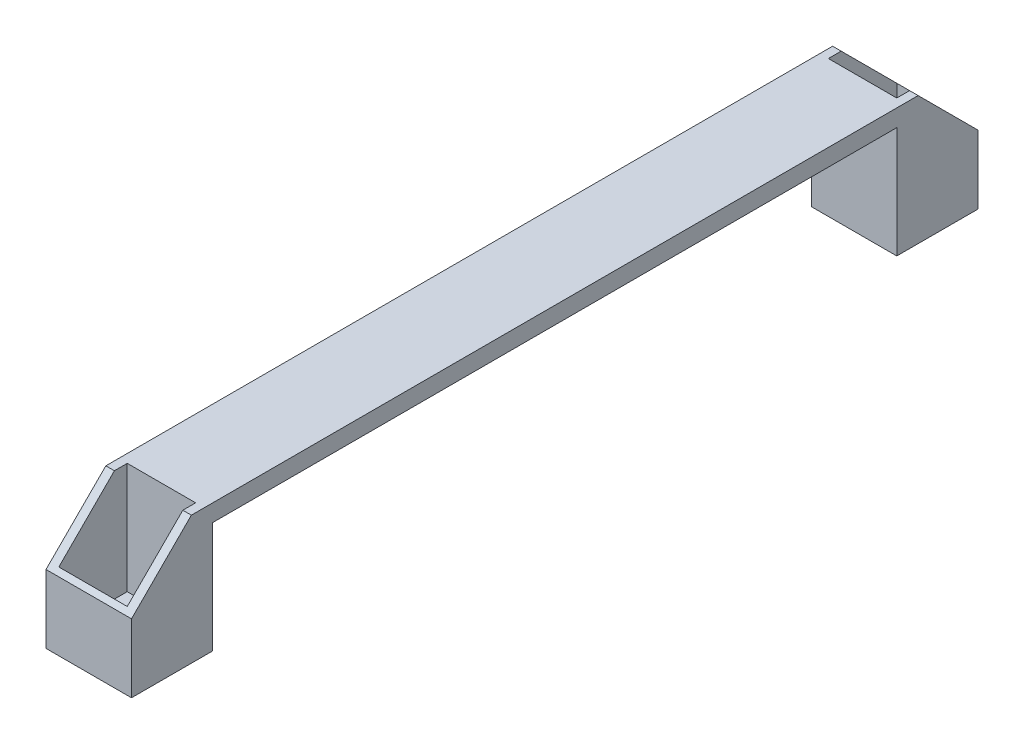
ISO-10303-21;
HEADER;
FILE_DESCRIPTION(('STEP AP214'),'2;1');
FILE_NAME('part.step','',(''),(''),'','','');
FILE_SCHEMA(('AUTOMOTIVE_DESIGN { 1 0 10303 214 1 1 1 1 }'));
ENDSEC;
DATA;
#1=APPLICATION_CONTEXT('core data for automotive mechanical design processes');
#2=APPLICATION_PROTOCOL_DEFINITION('international standard','automotive_design',2000,#1);
#3=PRODUCT_CONTEXT('',#1,'mechanical');
#4=PRODUCT('Part','Part','',(#3));
#5=PRODUCT_RELATED_PRODUCT_CATEGORY('part','',(#4));
#6=PRODUCT_DEFINITION_FORMATION('','',#4);
#7=PRODUCT_DEFINITION_CONTEXT('part definition',#1,'design');
#8=PRODUCT_DEFINITION('design','',#6,#7);
#9=PRODUCT_DEFINITION_SHAPE('','',#8);
#10=(LENGTH_UNIT() NAMED_UNIT(*) SI_UNIT(.MILLI.,.METRE.));
#11=(NAMED_UNIT(*) PLANE_ANGLE_UNIT() SI_UNIT($,.RADIAN.));
#12=(NAMED_UNIT(*) SI_UNIT($,.STERADIAN.) SOLID_ANGLE_UNIT());
#13=UNCERTAINTY_MEASURE_WITH_UNIT(LENGTH_MEASURE(1.E-05),#10,'distance_accuracy_value','');
#14=(GEOMETRIC_REPRESENTATION_CONTEXT(3) GLOBAL_UNCERTAINTY_ASSIGNED_CONTEXT((#13)) GLOBAL_UNIT_ASSIGNED_CONTEXT((#10,
#11,#12)) REPRESENTATION_CONTEXT('',''));
#15=CARTESIAN_POINT('',(0.,0.,0.));
#16=DIRECTION('',(0.,0.,1.));
#17=DIRECTION('',(1.,0.,0.));
#18=AXIS2_PLACEMENT_3D('',#15,#16,#17);
#19=CARTESIAN_POINT('',(0.,30.,0.));
#20=DIRECTION('',(1.,0.,0.));
#21=DIRECTION('',(0.,0.,-1.));
#22=AXIS2_PLACEMENT_3D('',#19,#20,#21);
#23=PLANE('',#22);
#24=DIRECTION('',(0.,0.,1.));
#25=VECTOR('',#24,1.);
#26=CARTESIAN_POINT('',(0.,0.,160.));
#27=LINE('',#26,#25);
#28=CARTESIAN_POINT('',(0.,0.,160.));
#29=VERTEX_POINT('',#28);
#30=CARTESIAN_POINT('',(0.,0.,179.));
#31=VERTEX_POINT('',#30);
#32=EDGE_CURVE('E199',#29,#31,#27,.T.);
#33=ORIENTED_EDGE('',*,*,#32,.T.);
#34=DIRECTION('',(0.,1.,0.));
#35=VECTOR('',#34,1.);
#36=CARTESIAN_POINT('',(0.,30.,179.));
#37=LINE('',#36,#35);
#38=CARTESIAN_POINT('',(0.,16.,179.));
#39=VERTEX_POINT('',#38);
#40=EDGE_CURVE('E176',#31,#39,#37,.T.);
#41=ORIENTED_EDGE('',*,*,#40,.T.);
#42=DIRECTION('',(0.,0.707106781186549,-0.707106781186546));
#43=VECTOR('',#42,1.);
#44=CARTESIAN_POINT('',(0.,112.5,82.5000000000004));
#45=LINE('',#44,#43);
#46=CARTESIAN_POINT('',(0.,30.,165.));
#47=VERTEX_POINT('',#46);
#48=EDGE_CURVE('E395',#39,#47,#45,.T.);
#49=ORIENTED_EDGE('',*,*,#48,.T.);
#50=DIRECTION('',(0.,0.,1.));
#51=VECTOR('',#50,1.);
#52=CARTESIAN_POINT('',(0.,30.,0.));
#53=LINE('',#52,#51);
#54=CARTESIAN_POINT('',(0.,30.,-4.99999999999984));
#55=VERTEX_POINT('',#54);
#56=EDGE_CURVE('E284',#55,#47,#53,.T.);
#57=ORIENTED_EDGE('',*,*,#56,.F.);
#58=DIRECTION('',(0.,-0.707106781186544,-0.707106781186551));
#59=VECTOR('',#58,1.);
#60=CARTESIAN_POINT('',(0.,32.4999999999999,-2.49999999999989));
#61=LINE('',#60,#59);
#62=CARTESIAN_POINT('',(0.,16.,-19.));
#63=VERTEX_POINT('',#62);
#64=EDGE_CURVE('E324',#55,#63,#61,.T.);
#65=ORIENTED_EDGE('',*,*,#64,.T.);
#66=DIRECTION('',(0.,-1.,0.));
#67=VECTOR('',#66,1.);
#68=CARTESIAN_POINT('',(0.,30.,-19.));
#69=LINE('',#68,#67);
#70=CARTESIAN_POINT('',(0.,0.,-19.));
#71=VERTEX_POINT('',#70);
#72=EDGE_CURVE('E61',#63,#71,#69,.T.);
#73=ORIENTED_EDGE('',*,*,#72,.T.);
#74=DIRECTION('',(0.,0.,1.));
#75=VECTOR('',#74,1.);
#76=CARTESIAN_POINT('',(0.,0.,0.));
#77=LINE('',#76,#75);
#78=CARTESIAN_POINT('',(0.,0.,0.));
#79=VERTEX_POINT('',#78);
#80=EDGE_CURVE('E273',#71,#79,#77,.T.);
#81=ORIENTED_EDGE('',*,*,#80,.T.);
#82=DIRECTION('',(0.,-1.,0.));
#83=VECTOR('',#82,1.);
#84=CARTESIAN_POINT('',(0.,30.,0.));
#85=LINE('',#84,#83);
#86=CARTESIAN_POINT('',(0.,26.,0.));
#87=VERTEX_POINT('',#86);
#88=EDGE_CURVE('E305',#87,#79,#85,.T.);
#89=ORIENTED_EDGE('',*,*,#88,.F.);
#90=DIRECTION('',(0.,0.,1.));
#91=VECTOR('',#90,1.);
#92=CARTESIAN_POINT('',(0.,26.,0.));
#93=LINE('',#92,#91);
#94=CARTESIAN_POINT('',(0.,26.,160.));
#95=VERTEX_POINT('',#94);
#96=EDGE_CURVE('E225',#87,#95,#93,.T.);
#97=ORIENTED_EDGE('',*,*,#96,.T.);
#98=DIRECTION('',(0.,-1.,0.));
#99=VECTOR('',#98,1.);
#100=CARTESIAN_POINT('',(0.,30.,160.));
#101=LINE('',#100,#99);
#102=EDGE_CURVE('E203',#95,#29,#101,.T.);
#103=ORIENTED_EDGE('',*,*,#102,.T.);
#104=EDGE_LOOP('',(#33,#41,#49,#57,#65,#73,#81,#89,#97,#103));
#105=FACE_BOUND('',#104,.T.);
#106=ADVANCED_FACE('F39',(#105),#23,.F.);
#107=CARTESIAN_POINT('',(0.,30.,0.));
#108=DIRECTION('',(0.,0.,-1.));
#109=DIRECTION('',(-1.,0.,0.));
#110=AXIS2_PLACEMENT_3D('',#107,#108,#109);
#111=PLANE('',#110);
#112=DIRECTION('',(0.,-1.,0.));
#113=VECTOR('',#112,1.);
#114=CARTESIAN_POINT('',(20.,30.,0.));
#115=LINE('',#114,#113);
#116=CARTESIAN_POINT('',(20.,26.,0.));
#117=VERTEX_POINT('',#116);
#118=CARTESIAN_POINT('',(20.,0.,0.));
#119=VERTEX_POINT('',#118);
#120=EDGE_CURVE('E293',#117,#119,#115,.T.);
#121=ORIENTED_EDGE('',*,*,#120,.F.);
#122=DIRECTION('',(-1.,0.,0.));
#123=VECTOR('',#122,1.);
#124=CARTESIAN_POINT('',(0.,26.,0.));
#125=LINE('',#124,#123);
#126=EDGE_CURVE('E221',#117,#87,#125,.T.);
#127=ORIENTED_EDGE('',*,*,#126,.T.);
#128=ORIENTED_EDGE('',*,*,#88,.T.);
#129=DIRECTION('',(1.,0.,0.));
#130=VECTOR('',#129,1.);
#131=CARTESIAN_POINT('',(0.,0.,0.));
#132=LINE('',#131,#130);
#133=EDGE_CURVE('E296',#79,#119,#132,.T.);
#134=ORIENTED_EDGE('',*,*,#133,.T.);
#135=EDGE_LOOP('',(#121,#127,#128,#134));
#136=FACE_BOUND('',#135,.T.);
#137=ADVANCED_FACE('F456',(#136),#111,.F.);
#138=CARTESIAN_POINT('',(20.,30.,0.));
#139=DIRECTION('',(-1.,0.,0.));
#140=DIRECTION('',(0.,0.,1.));
#141=AXIS2_PLACEMENT_3D('',#138,#139,#140);
#142=PLANE('',#141);
#143=DIRECTION('',(0.,0.707106781186549,-0.707106781186546));
#144=VECTOR('',#143,1.);
#145=CARTESIAN_POINT('',(20.,15.,180.));
#146=LINE('',#145,#144);
#147=CARTESIAN_POINT('',(20.,16.,179.));
#148=VERTEX_POINT('',#147);
#149=CARTESIAN_POINT('',(20.,30.,165.));
#150=VERTEX_POINT('',#149);
#151=EDGE_CURVE('E190',#148,#150,#146,.T.);
#152=ORIENTED_EDGE('',*,*,#151,.F.);
#153=DIRECTION('',(0.,1.,0.));
#154=VECTOR('',#153,1.);
#155=CARTESIAN_POINT('',(20.,0.,179.));
#156=LINE('',#155,#154);
#157=CARTESIAN_POINT('',(20.,0.,179.));
#158=VERTEX_POINT('',#157);
#159=EDGE_CURVE('E54',#158,#148,#156,.T.);
#160=ORIENTED_EDGE('',*,*,#159,.F.);
#161=DIRECTION('',(0.,0.,-1.));
#162=VECTOR('',#161,1.);
#163=CARTESIAN_POINT('',(20.,0.,160.));
#164=LINE('',#163,#162);
#165=CARTESIAN_POINT('',(20.,0.,160.));
#166=VERTEX_POINT('',#165);
#167=EDGE_CURVE('E187',#158,#166,#164,.T.);
#168=ORIENTED_EDGE('',*,*,#167,.T.);
#169=DIRECTION('',(0.,-1.,0.));
#170=VECTOR('',#169,1.);
#171=CARTESIAN_POINT('',(20.,30.,160.));
#172=LINE('',#171,#170);
#173=CARTESIAN_POINT('',(20.,26.,160.));
#174=VERTEX_POINT('',#173);
#175=EDGE_CURVE('E211',#174,#166,#172,.T.);
#176=ORIENTED_EDGE('',*,*,#175,.F.);
#177=DIRECTION('',(0.,0.,1.));
#178=VECTOR('',#177,1.);
#179=CARTESIAN_POINT('',(20.,26.,0.));
#180=LINE('',#179,#178);
#181=EDGE_CURVE('E232',#117,#174,#180,.T.);
#182=ORIENTED_EDGE('',*,*,#181,.F.);
#183=ORIENTED_EDGE('',*,*,#120,.T.);
#184=DIRECTION('',(0.,0.,-1.));
#185=VECTOR('',#184,1.);
#186=CARTESIAN_POINT('',(20.,0.,0.));
#187=LINE('',#186,#185);
#188=CARTESIAN_POINT('',(20.,0.,-19.));
#189=VERTEX_POINT('',#188);
#190=EDGE_CURVE('E289',#119,#189,#187,.T.);
#191=ORIENTED_EDGE('',*,*,#190,.T.);
#192=DIRECTION('',(0.,-1.,0.));
#193=VECTOR('',#192,1.);
#194=CARTESIAN_POINT('',(20.,0.,-19.));
#195=LINE('',#194,#193);
#196=CARTESIAN_POINT('',(20.,16.,-19.));
#197=VERTEX_POINT('',#196);
#198=EDGE_CURVE('E445',#197,#189,#195,.T.);
#199=ORIENTED_EDGE('',*,*,#198,.F.);
#200=DIRECTION('',(0.,-0.707106781186544,-0.707106781186551));
#201=VECTOR('',#200,1.);
#202=CARTESIAN_POINT('',(20.,15.,-20.));
#203=LINE('',#202,#201);
#204=CARTESIAN_POINT('',(20.,30.,-4.99999999999984));
#205=VERTEX_POINT('',#204);
#206=EDGE_CURVE('E327',#205,#197,#203,.T.);
#207=ORIENTED_EDGE('',*,*,#206,.F.);
#208=DIRECTION('',(0.,0.,-1.));
#209=VECTOR('',#208,1.);
#210=CARTESIAN_POINT('',(20.,30.,0.));
#211=LINE('',#210,#209);
#212=EDGE_CURVE('E288',#150,#205,#211,.T.);
#213=ORIENTED_EDGE('',*,*,#212,.F.);
#214=EDGE_LOOP('',(#152,#160,#168,#176,#182,#183,#191,#199,#207,#213));
#215=FACE_BOUND('',#214,.T.);
#216=ADVANCED_FACE('F185',(#215),#142,.F.);
#217=CARTESIAN_POINT('',(0.,30.,0.));
#218=DIRECTION('',(0.,-1.,0.));
#219=DIRECTION('',(0.,0.,-1.));
#220=AXIS2_PLACEMENT_3D('',#217,#218,#219);
#221=PLANE('',#220);
#222=ORIENTED_EDGE('',*,*,#56,.T.);
#223=DIRECTION('',(1.,0.,0.));
#224=VECTOR('',#223,1.);
#225=CARTESIAN_POINT('',(-120.,30.,165.));
#226=LINE('',#225,#224);
#227=CARTESIAN_POINT('',(2.,30.,165.));
#228=VERTEX_POINT('',#227);
#229=EDGE_CURVE('E402',#47,#228,#226,.T.);
#230=ORIENTED_EDGE('',*,*,#229,.T.);
#231=DIRECTION('',(0.,0.,1.));
#232=VECTOR('',#231,1.);
#233=CARTESIAN_POINT('',(2.,30.,162.));
#234=LINE('',#233,#232);
#235=CARTESIAN_POINT('',(2.,30.,162.));
#236=VERTEX_POINT('',#235);
#237=EDGE_CURVE('E219',#236,#228,#234,.T.);
#238=ORIENTED_EDGE('',*,*,#237,.F.);
#239=DIRECTION('',(-1.,0.,0.));
#240=VECTOR('',#239,1.);
#241=CARTESIAN_POINT('',(2.,30.,162.));
#242=LINE('',#241,#240);
#243=CARTESIAN_POINT('',(18.,30.,162.));
#244=VERTEX_POINT('',#243);
#245=EDGE_CURVE('E349',#244,#236,#242,.T.);
#246=ORIENTED_EDGE('',*,*,#245,.F.);
#247=DIRECTION('',(0.,0.,-1.));
#248=VECTOR('',#247,1.);
#249=CARTESIAN_POINT('',(18.,30.,162.));
#250=LINE('',#249,#248);
#251=CARTESIAN_POINT('',(18.,30.,165.));
#252=VERTEX_POINT('',#251);
#253=EDGE_CURVE('E365',#252,#244,#250,.T.);
#254=ORIENTED_EDGE('',*,*,#253,.F.);
#255=EDGE_CURVE('E433',#252,#150,#226,.T.);
#256=ORIENTED_EDGE('',*,*,#255,.T.);
#257=ORIENTED_EDGE('',*,*,#212,.T.);
#258=DIRECTION('',(1.,0.,0.));
#259=VECTOR('',#258,1.);
#260=CARTESIAN_POINT('',(-120.,30.,-4.99999999999984));
#261=LINE('',#260,#259);
#262=CARTESIAN_POINT('',(18.,30.,-4.99999999999984));
#263=VERTEX_POINT('',#262);
#264=EDGE_CURVE('E422',#263,#205,#261,.T.);
#265=ORIENTED_EDGE('',*,*,#264,.F.);
#266=DIRECTION('',(0.,0.,-1.));
#267=VECTOR('',#266,1.);
#268=CARTESIAN_POINT('',(18.,30.,-18.));
#269=LINE('',#268,#267);
#270=CARTESIAN_POINT('',(18.,30.,-2.));
#271=VERTEX_POINT('',#270);
#272=EDGE_CURVE('E246',#271,#263,#269,.T.);
#273=ORIENTED_EDGE('',*,*,#272,.F.);
#274=DIRECTION('',(1.,0.,0.));
#275=VECTOR('',#274,1.);
#276=CARTESIAN_POINT('',(2.,30.,-2.));
#277=LINE('',#276,#275);
#278=CARTESIAN_POINT('',(2.,30.,-2.));
#279=VERTEX_POINT('',#278);
#280=EDGE_CURVE('E262',#279,#271,#277,.T.);
#281=ORIENTED_EDGE('',*,*,#280,.F.);
#282=DIRECTION('',(0.,0.,1.));
#283=VECTOR('',#282,1.);
#284=CARTESIAN_POINT('',(2.,30.,-18.));
#285=LINE('',#284,#283);
#286=CARTESIAN_POINT('',(2.,30.,-4.99999999999984));
#287=VERTEX_POINT('',#286);
#288=EDGE_CURVE('E259',#287,#279,#285,.T.);
#289=ORIENTED_EDGE('',*,*,#288,.F.);
#290=EDGE_CURVE('E428',#55,#287,#261,.T.);
#291=ORIENTED_EDGE('',*,*,#290,.F.);
#292=EDGE_LOOP('',(#222,#230,#238,#246,#254,#256,#257,#265,#273,#281,#289,#291));
#293=FACE_BOUND('',#292,.T.);
#294=ADVANCED_FACE('F424',(#293),#221,.F.);
#295=CARTESIAN_POINT('',(0.,0.,0.));
#296=DIRECTION('',(0.,-1.,0.));
#297=DIRECTION('',(0.,0.,-1.));
#298=AXIS2_PLACEMENT_3D('',#295,#296,#297);
#299=PLANE('',#298);
#300=DIRECTION('',(1.,0.,0.));
#301=VECTOR('',#300,1.);
#302=CARTESIAN_POINT('',(-120.,0.,-19.));
#303=LINE('',#302,#301);
#304=EDGE_CURVE('E192',#71,#189,#303,.T.);
#305=ORIENTED_EDGE('',*,*,#304,.T.);
#306=ORIENTED_EDGE('',*,*,#190,.F.);
#307=ORIENTED_EDGE('',*,*,#133,.F.);
#308=ORIENTED_EDGE('',*,*,#80,.F.);
#309=EDGE_LOOP('',(#305,#306,#307,#308));
#310=FACE_BOUND('',#309,.T.);
#311=CARTESIAN_POINT('',(10.,0.,-10.));
#312=DIRECTION('',(0.,-1.,0.));
#313=DIRECTION('',(0.,0.,-1.));
#314=AXIS2_PLACEMENT_3D('',#311,#312,#313);
#315=CIRCLE('',#314,3.);
#316=CARTESIAN_POINT('',(10.,0.,-13.));
#317=VERTEX_POINT('',#316);
#318=EDGE_CURVE('E240',#317,#317,#315,.T.);
#319=ORIENTED_EDGE('',*,*,#318,.F.);
#320=EDGE_LOOP('',(#319));
#321=FACE_BOUND('',#320,.T.);
#322=ADVANCED_FACE('F450',(#310,#321),#299,.T.);
#323=CARTESIAN_POINT('',(2.,4.,-18.));
#324=DIRECTION('',(-1.,0.,0.));
#325=DIRECTION('',(0.,0.,1.));
#326=AXIS2_PLACEMENT_3D('',#323,#324,#325);
#327=PLANE('',#326);
#328=DIRECTION('',(0.,1.,0.));
#329=VECTOR('',#328,1.);
#330=CARTESIAN_POINT('',(2.,4.,-18.));
#331=LINE('',#330,#329);
#332=CARTESIAN_POINT('',(2.,4.,-18.));
#333=VERTEX_POINT('',#332);
#334=CARTESIAN_POINT('',(2.,17.,-18.));
#335=VERTEX_POINT('',#334);
#336=EDGE_CURVE('E269',#333,#335,#331,.T.);
#337=ORIENTED_EDGE('',*,*,#336,.T.);
#338=DIRECTION('',(0.,0.707106781186544,0.707106781186551));
#339=VECTOR('',#338,1.);
#340=CARTESIAN_POINT('',(2.,10.5000000000001,-24.5));
#341=LINE('',#340,#339);
#342=EDGE_CURVE('E333',#335,#287,#341,.T.);
#343=ORIENTED_EDGE('',*,*,#342,.T.);
#344=ORIENTED_EDGE('',*,*,#288,.T.);
#345=DIRECTION('',(0.,1.,0.));
#346=VECTOR('',#345,1.);
#347=CARTESIAN_POINT('',(2.,4.,-2.));
#348=LINE('',#347,#346);
#349=CARTESIAN_POINT('',(2.,4.,-2.));
#350=VERTEX_POINT('',#349);
#351=EDGE_CURVE('E258',#350,#279,#348,.T.);
#352=ORIENTED_EDGE('',*,*,#351,.F.);
#353=DIRECTION('',(0.,0.,1.));
#354=VECTOR('',#353,1.);
#355=CARTESIAN_POINT('',(2.,4.,-18.));
#356=LINE('',#355,#354);
#357=EDGE_CURVE('E241',#333,#350,#356,.T.);
#358=ORIENTED_EDGE('',*,*,#357,.F.);
#359=EDGE_LOOP('',(#337,#343,#344,#352,#358));
#360=FACE_BOUND('',#359,.T.);
#361=ADVANCED_FACE('F412',(#360),#327,.F.);
#362=CARTESIAN_POINT('',(2.,4.,-18.));
#363=DIRECTION('',(0.,0.,-1.));
#364=DIRECTION('',(-1.,0.,0.));
#365=AXIS2_PLACEMENT_3D('',#362,#363,#364);
#366=PLANE('',#365);
#367=DIRECTION('',(0.,1.,0.));
#368=VECTOR('',#367,1.);
#369=CARTESIAN_POINT('',(18.,4.,-18.));
#370=LINE('',#369,#368);
#371=CARTESIAN_POINT('',(18.,4.,-18.));
#372=VERTEX_POINT('',#371);
#373=CARTESIAN_POINT('',(18.,17.,-18.));
#374=VERTEX_POINT('',#373);
#375=EDGE_CURVE('E274',#372,#374,#370,.T.);
#376=ORIENTED_EDGE('',*,*,#375,.T.);
#377=DIRECTION('',(-1.,0.,0.));
#378=VECTOR('',#377,1.);
#379=CARTESIAN_POINT('',(2.,17.,-18.));
#380=LINE('',#379,#378);
#381=EDGE_CURVE('E340',#374,#335,#380,.T.);
#382=ORIENTED_EDGE('',*,*,#381,.T.);
#383=ORIENTED_EDGE('',*,*,#336,.F.);
#384=DIRECTION('',(-1.,0.,0.));
#385=VECTOR('',#384,1.);
#386=CARTESIAN_POINT('',(2.,4.,-18.));
#387=LINE('',#386,#385);
#388=EDGE_CURVE('E254',#372,#333,#387,.T.);
#389=ORIENTED_EDGE('',*,*,#388,.F.);
#390=EDGE_LOOP('',(#376,#382,#383,#389));
#391=FACE_BOUND('',#390,.T.);
#392=ADVANCED_FACE('F408',(#391),#366,.F.);
#393=CARTESIAN_POINT('',(18.,4.,-18.));
#394=DIRECTION('',(1.,0.,0.));
#395=DIRECTION('',(0.,0.,-1.));
#396=AXIS2_PLACEMENT_3D('',#393,#394,#395);
#397=PLANE('',#396);
#398=ORIENTED_EDGE('',*,*,#272,.T.);
#399=DIRECTION('',(0.,-0.707106781186544,-0.707106781186551));
#400=VECTOR('',#399,1.);
#401=CARTESIAN_POINT('',(18.,10.5000000000001,-24.5));
#402=LINE('',#401,#400);
#403=EDGE_CURVE('E316',#263,#374,#402,.T.);
#404=ORIENTED_EDGE('',*,*,#403,.T.);
#405=ORIENTED_EDGE('',*,*,#375,.F.);
#406=DIRECTION('',(0.,0.,-1.));
#407=VECTOR('',#406,1.);
#408=CARTESIAN_POINT('',(18.,4.,-18.));
#409=LINE('',#408,#407);
#410=CARTESIAN_POINT('',(18.,4.,-2.));
#411=VERTEX_POINT('',#410);
#412=EDGE_CURVE('E250',#411,#372,#409,.T.);
#413=ORIENTED_EDGE('',*,*,#412,.F.);
#414=DIRECTION('',(0.,1.,0.));
#415=VECTOR('',#414,1.);
#416=CARTESIAN_POINT('',(18.,4.,-2.));
#417=LINE('',#416,#415);
#418=EDGE_CURVE('E278',#411,#271,#417,.T.);
#419=ORIENTED_EDGE('',*,*,#418,.T.);
#420=EDGE_LOOP('',(#398,#404,#405,#413,#419));
#421=FACE_BOUND('',#420,.T.);
#422=ADVANCED_FACE('F419',(#421),#397,.F.);
#423=CARTESIAN_POINT('',(2.,4.,-2.));
#424=DIRECTION('',(0.,0.,1.));
#425=DIRECTION('',(1.,0.,0.));
#426=AXIS2_PLACEMENT_3D('',#423,#424,#425);
#427=PLANE('',#426);
#428=ORIENTED_EDGE('',*,*,#280,.T.);
#429=ORIENTED_EDGE('',*,*,#418,.F.);
#430=DIRECTION('',(1.,0.,0.));
#431=VECTOR('',#430,1.);
#432=CARTESIAN_POINT('',(2.,4.,-2.));
#433=LINE('',#432,#431);
#434=EDGE_CURVE('E245',#350,#411,#433,.T.);
#435=ORIENTED_EDGE('',*,*,#434,.F.);
#436=ORIENTED_EDGE('',*,*,#351,.T.);
#437=EDGE_LOOP('',(#428,#429,#435,#436));
#438=FACE_BOUND('',#437,.T.);
#439=ADVANCED_FACE('F466',(#438),#427,.F.);
#440=CARTESIAN_POINT('',(0.,4.,0.));
#441=DIRECTION('',(0.,1.,0.));
#442=DIRECTION('',(0.,0.,1.));
#443=AXIS2_PLACEMENT_3D('',#440,#441,#442);
#444=PLANE('',#443);
#445=CARTESIAN_POINT('',(10.,4.,-10.));
#446=DIRECTION('',(0.,1.,0.));
#447=DIRECTION('',(0.,0.,1.));
#448=AXIS2_PLACEMENT_3D('',#445,#446,#447);
#449=CIRCLE('',#448,3.);
#450=CARTESIAN_POINT('',(10.,4.,-7.));
#451=VERTEX_POINT('',#450);
#452=EDGE_CURVE('E236',#451,#451,#449,.T.);
#453=ORIENTED_EDGE('',*,*,#452,.F.);
#454=EDGE_LOOP('',(#453));
#455=FACE_BOUND('',#454,.T.);
#456=ORIENTED_EDGE('',*,*,#357,.T.);
#457=ORIENTED_EDGE('',*,*,#434,.T.);
#458=ORIENTED_EDGE('',*,*,#412,.T.);
#459=ORIENTED_EDGE('',*,*,#388,.T.);
#460=EDGE_LOOP('',(#456,#457,#458,#459));
#461=FACE_BOUND('',#460,.T.);
#462=ADVANCED_FACE('F416',(#455,#461),#444,.T.);
#463=CARTESIAN_POINT('',(10.,-52.,-10.));
#464=DIRECTION('',(0.,1.,0.));
#465=DIRECTION('',(0.,0.,1.));
#466=AXIS2_PLACEMENT_3D('',#463,#464,#465);
#467=CYLINDRICAL_SURFACE('',#466,3.);
#468=ORIENTED_EDGE('',*,*,#318,.T.);
#469=EDGE_LOOP('',(#468));
#470=FACE_BOUND('',#469,.T.);
#471=ORIENTED_EDGE('',*,*,#452,.T.);
#472=EDGE_LOOP('',(#471));
#473=FACE_BOUND('',#472,.T.);
#474=ADVANCED_FACE('F473',(#470,#473),#467,.F.);
#475=CARTESIAN_POINT('',(0.,26.,0.));
#476=DIRECTION('',(0.,1.,0.));
#477=DIRECTION('',(-1.,0.,0.));
#478=AXIS2_PLACEMENT_3D('',#475,#476,#477);
#479=PLANE('',#478);
#480=DIRECTION('',(-1.,0.,0.));
#481=VECTOR('',#480,1.);
#482=CARTESIAN_POINT('',(0.,26.,160.));
#483=LINE('',#482,#481);
#484=EDGE_CURVE('E214',#174,#95,#483,.T.);
#485=ORIENTED_EDGE('',*,*,#484,.T.);
#486=ORIENTED_EDGE('',*,*,#96,.F.);
#487=ORIENTED_EDGE('',*,*,#126,.F.);
#488=ORIENTED_EDGE('',*,*,#181,.T.);
#489=EDGE_LOOP('',(#485,#486,#487,#488));
#490=FACE_BOUND('',#489,.T.);
#491=ADVANCED_FACE('F459',(#490),#479,.F.);
#492=CARTESIAN_POINT('',(0.,30.,160.));
#493=DIRECTION('',(0.,0.,1.));
#494=DIRECTION('',(1.,0.,0.));
#495=AXIS2_PLACEMENT_3D('',#492,#493,#494);
#496=PLANE('',#495);
#497=ORIENTED_EDGE('',*,*,#484,.F.);
#498=ORIENTED_EDGE('',*,*,#175,.T.);
#499=DIRECTION('',(-1.,0.,0.));
#500=VECTOR('',#499,1.);
#501=CARTESIAN_POINT('',(0.,0.,160.));
#502=LINE('',#501,#500);
#503=EDGE_CURVE('E197',#166,#29,#502,.T.);
#504=ORIENTED_EDGE('',*,*,#503,.T.);
#505=ORIENTED_EDGE('',*,*,#102,.F.);
#506=EDGE_LOOP('',(#497,#498,#504,#505));
#507=FACE_BOUND('',#506,.T.);
#508=ADVANCED_FACE('F461',(#507),#496,.F.);
#509=CARTESIAN_POINT('',(0.,0.,0.));
#510=DIRECTION('',(0.,1.,0.));
#511=DIRECTION('',(0.,0.,1.));
#512=AXIS2_PLACEMENT_3D('',#509,#510,#511);
#513=PLANE('',#512);
#514=CARTESIAN_POINT('',(10.,0.,170.));
#515=DIRECTION('',(0.,1.,0.));
#516=DIRECTION('',(0.,0.,1.));
#517=AXIS2_PLACEMENT_3D('',#514,#515,#516);
#518=CIRCLE('',#517,3.);
#519=CARTESIAN_POINT('',(10.,0.,173.));
#520=VERTEX_POINT('',#519);
#521=EDGE_CURVE('E215',#520,#520,#518,.T.);
#522=ORIENTED_EDGE('',*,*,#521,.T.);
#523=EDGE_LOOP('',(#522));
#524=FACE_BOUND('',#523,.T.);
#525=ORIENTED_EDGE('',*,*,#167,.F.);
#526=DIRECTION('',(1.,0.,0.));
#527=VECTOR('',#526,1.);
#528=CARTESIAN_POINT('',(-120.,0.,179.));
#529=LINE('',#528,#527);
#530=EDGE_CURVE('E173',#31,#158,#529,.T.);
#531=ORIENTED_EDGE('',*,*,#530,.F.);
#532=ORIENTED_EDGE('',*,*,#32,.F.);
#533=ORIENTED_EDGE('',*,*,#503,.F.);
#534=EDGE_LOOP('',(#525,#531,#532,#533));
#535=FACE_BOUND('',#534,.T.);
#536=ADVANCED_FACE('F195',(#524,#535),#513,.F.);
#537=CARTESIAN_POINT('',(2.,4.,162.));
#538=DIRECTION('',(-1.,0.,0.));
#539=DIRECTION('',(0.,0.,1.));
#540=AXIS2_PLACEMENT_3D('',#537,#538,#539);
#541=PLANE('',#540);
#542=ORIENTED_EDGE('',*,*,#237,.T.);
#543=DIRECTION('',(0.,-0.707106781186549,0.707106781186546));
#544=VECTOR('',#543,1.);
#545=CARTESIAN_POINT('',(2.,18.5,176.5));
#546=LINE('',#545,#544);
#547=CARTESIAN_POINT('',(2.,17.,178.));
#548=VERTEX_POINT('',#547);
#549=EDGE_CURVE('E389',#228,#548,#546,.T.);
#550=ORIENTED_EDGE('',*,*,#549,.T.);
#551=DIRECTION('',(0.,1.,0.));
#552=VECTOR('',#551,1.);
#553=CARTESIAN_POINT('',(2.,4.,178.));
#554=LINE('',#553,#552);
#555=CARTESIAN_POINT('',(2.,4.,178.));
#556=VERTEX_POINT('',#555);
#557=EDGE_CURVE('E361',#556,#548,#554,.T.);
#558=ORIENTED_EDGE('',*,*,#557,.F.);
#559=DIRECTION('',(0.,0.,1.));
#560=VECTOR('',#559,1.);
#561=CARTESIAN_POINT('',(2.,4.,162.));
#562=LINE('',#561,#560);
#563=CARTESIAN_POINT('',(2.,4.,162.));
#564=VERTEX_POINT('',#563);
#565=EDGE_CURVE('E344',#564,#556,#562,.T.);
#566=ORIENTED_EDGE('',*,*,#565,.F.);
#567=DIRECTION('',(0.,1.,0.));
#568=VECTOR('',#567,1.);
#569=CARTESIAN_POINT('',(2.,4.,162.));
#570=LINE('',#569,#568);
#571=EDGE_CURVE('E205',#564,#236,#570,.T.);
#572=ORIENTED_EDGE('',*,*,#571,.T.);
#573=EDGE_LOOP('',(#542,#550,#558,#566,#572));
#574=FACE_BOUND('',#573,.T.);
#575=ADVANCED_FACE('F388',(#574),#541,.F.);
#576=CARTESIAN_POINT('',(2.,4.,162.));
#577=DIRECTION('',(0.,0.,-1.));
#578=DIRECTION('',(-1.,0.,0.));
#579=AXIS2_PLACEMENT_3D('',#576,#577,#578);
#580=PLANE('',#579);
#581=ORIENTED_EDGE('',*,*,#245,.T.);
#582=ORIENTED_EDGE('',*,*,#571,.F.);
#583=DIRECTION('',(-1.,0.,0.));
#584=VECTOR('',#583,1.);
#585=CARTESIAN_POINT('',(2.,4.,162.));
#586=LINE('',#585,#584);
#587=CARTESIAN_POINT('',(18.,4.,162.));
#588=VERTEX_POINT('',#587);
#589=EDGE_CURVE('E357',#588,#564,#586,.T.);
#590=ORIENTED_EDGE('',*,*,#589,.F.);
#591=DIRECTION('',(0.,1.,0.));
#592=VECTOR('',#591,1.);
#593=CARTESIAN_POINT('',(18.,4.,162.));
#594=LINE('',#593,#592);
#595=EDGE_CURVE('E373',#588,#244,#594,.T.);
#596=ORIENTED_EDGE('',*,*,#595,.T.);
#597=EDGE_LOOP('',(#581,#582,#590,#596));
#598=FACE_BOUND('',#597,.T.);
#599=ADVANCED_FACE('F510',(#598),#580,.F.);
#600=CARTESIAN_POINT('',(18.,4.,162.));
#601=DIRECTION('',(1.,0.,0.));
#602=DIRECTION('',(0.,0.,-1.));
#603=AXIS2_PLACEMENT_3D('',#600,#601,#602);
#604=PLANE('',#603);
#605=DIRECTION('',(0.,1.,0.));
#606=VECTOR('',#605,1.);
#607=CARTESIAN_POINT('',(18.,4.,178.));
#608=LINE('',#607,#606);
#609=CARTESIAN_POINT('',(18.,4.,178.));
#610=VERTEX_POINT('',#609);
#611=CARTESIAN_POINT('',(18.,17.,178.));
#612=VERTEX_POINT('',#611);
#613=EDGE_CURVE('E377',#610,#612,#608,.T.);
#614=ORIENTED_EDGE('',*,*,#613,.T.);
#615=DIRECTION('',(0.,0.707106781186549,-0.707106781186546));
#616=VECTOR('',#615,1.);
#617=CARTESIAN_POINT('',(18.,18.5,176.5));
#618=LINE('',#617,#616);
#619=EDGE_CURVE('E396',#612,#252,#618,.T.);
#620=ORIENTED_EDGE('',*,*,#619,.T.);
#621=ORIENTED_EDGE('',*,*,#253,.T.);
#622=ORIENTED_EDGE('',*,*,#595,.F.);
#623=DIRECTION('',(0.,0.,-1.));
#624=VECTOR('',#623,1.);
#625=CARTESIAN_POINT('',(18.,4.,162.));
#626=LINE('',#625,#624);
#627=EDGE_CURVE('E353',#610,#588,#626,.T.);
#628=ORIENTED_EDGE('',*,*,#627,.F.);
#629=EDGE_LOOP('',(#614,#620,#621,#622,#628));
#630=FACE_BOUND('',#629,.T.);
#631=ADVANCED_FACE('F514',(#630),#604,.F.);
#632=CARTESIAN_POINT('',(2.,4.,178.));
#633=DIRECTION('',(0.,0.,1.));
#634=DIRECTION('',(1.,0.,0.));
#635=AXIS2_PLACEMENT_3D('',#632,#633,#634);
#636=PLANE('',#635);
#637=ORIENTED_EDGE('',*,*,#557,.T.);
#638=DIRECTION('',(1.,0.,0.));
#639=VECTOR('',#638,1.);
#640=CARTESIAN_POINT('',(2.,17.,178.));
#641=LINE('',#640,#639);
#642=EDGE_CURVE('E309',#548,#612,#641,.T.);
#643=ORIENTED_EDGE('',*,*,#642,.T.);
#644=ORIENTED_EDGE('',*,*,#613,.F.);
#645=DIRECTION('',(1.,0.,0.));
#646=VECTOR('',#645,1.);
#647=CARTESIAN_POINT('',(2.,4.,178.));
#648=LINE('',#647,#646);
#649=EDGE_CURVE('E348',#556,#610,#648,.T.);
#650=ORIENTED_EDGE('',*,*,#649,.F.);
#651=EDGE_LOOP('',(#637,#643,#644,#650));
#652=FACE_BOUND('',#651,.T.);
#653=ADVANCED_FACE('F384',(#652),#636,.F.);
#654=CARTESIAN_POINT('',(0.,4.,0.));
#655=DIRECTION('',(0.,1.,0.));
#656=DIRECTION('',(0.,0.,1.));
#657=AXIS2_PLACEMENT_3D('',#654,#655,#656);
#658=PLANE('',#657);
#659=CARTESIAN_POINT('',(10.,4.,170.));
#660=DIRECTION('',(0.,1.,0.));
#661=DIRECTION('',(0.,0.,1.));
#662=AXIS2_PLACEMENT_3D('',#659,#660,#661);
#663=CIRCLE('',#662,3.);
#664=CARTESIAN_POINT('',(10.,4.,173.));
#665=VERTEX_POINT('',#664);
#666=EDGE_CURVE('E220',#665,#665,#663,.T.);
#667=ORIENTED_EDGE('',*,*,#666,.F.);
#668=EDGE_LOOP('',(#667));
#669=FACE_BOUND('',#668,.T.);
#670=ORIENTED_EDGE('',*,*,#565,.T.);
#671=ORIENTED_EDGE('',*,*,#649,.T.);
#672=ORIENTED_EDGE('',*,*,#627,.T.);
#673=ORIENTED_EDGE('',*,*,#589,.T.);
#674=EDGE_LOOP('',(#670,#671,#672,#673));
#675=FACE_BOUND('',#674,.T.);
#676=ADVANCED_FACE('F513',(#669,#675),#658,.T.);
#677=CARTESIAN_POINT('',(10.,-52.,170.));
#678=DIRECTION('',(0.,1.,0.));
#679=DIRECTION('',(0.,0.,1.));
#680=AXIS2_PLACEMENT_3D('',#677,#678,#679);
#681=CYLINDRICAL_SURFACE('',#680,3.);
#682=ORIENTED_EDGE('',*,*,#666,.T.);
#683=EDGE_LOOP('',(#682));
#684=FACE_BOUND('',#683,.T.);
#685=ORIENTED_EDGE('',*,*,#521,.F.);
#686=EDGE_LOOP('',(#685));
#687=FACE_BOUND('',#686,.T.);
#688=ADVANCED_FACE('F523',(#684,#687),#681,.F.);
#689=CARTESIAN_POINT('',(-120.,15.,180.));
#690=DIRECTION('',(0.,-0.707106781186546,-0.707106781186549));
#691=DIRECTION('',(0.,0.707106781186549,-0.707106781186546));
#692=AXIS2_PLACEMENT_3D('',#689,#690,#691);
#693=PLANE('',#692);
#694=ORIENTED_EDGE('',*,*,#48,.F.);
#695=DIRECTION('',(1.,0.,0.));
#696=VECTOR('',#695,1.);
#697=CARTESIAN_POINT('',(-120.,16.,179.));
#698=LINE('',#697,#696);
#699=EDGE_CURVE('E11',#39,#148,#698,.T.);
#700=ORIENTED_EDGE('',*,*,#699,.T.);
#701=ORIENTED_EDGE('',*,*,#151,.T.);
#702=ORIENTED_EDGE('',*,*,#255,.F.);
#703=ORIENTED_EDGE('',*,*,#619,.F.);
#704=ORIENTED_EDGE('',*,*,#642,.F.);
#705=ORIENTED_EDGE('',*,*,#549,.F.);
#706=ORIENTED_EDGE('',*,*,#229,.F.);
#707=EDGE_LOOP('',(#694,#700,#701,#702,#703,#704,#705,#706));
#708=FACE_BOUND('',#707,.T.);
#709=ADVANCED_FACE('F463',(#708),#693,.F.);
#710=CARTESIAN_POINT('',(-120.,15.,-20.));
#711=DIRECTION('',(0.,-0.707106781186551,0.707106781186544));
#712=DIRECTION('',(0.,-0.707106781186544,-0.707106781186551));
#713=AXIS2_PLACEMENT_3D('',#710,#711,#712);
#714=PLANE('',#713);
#715=ORIENTED_EDGE('',*,*,#206,.T.);
#716=DIRECTION('',(-1.,0.,0.));
#717=VECTOR('',#716,1.);
#718=CARTESIAN_POINT('',(-120.,16.,-19.));
#719=LINE('',#718,#717);
#720=EDGE_CURVE('E47',#197,#63,#719,.T.);
#721=ORIENTED_EDGE('',*,*,#720,.T.);
#722=ORIENTED_EDGE('',*,*,#64,.F.);
#723=ORIENTED_EDGE('',*,*,#290,.T.);
#724=ORIENTED_EDGE('',*,*,#342,.F.);
#725=ORIENTED_EDGE('',*,*,#381,.F.);
#726=ORIENTED_EDGE('',*,*,#403,.F.);
#727=ORIENTED_EDGE('',*,*,#264,.T.);
#728=EDGE_LOOP('',(#715,#721,#722,#723,#724,#725,#726,#727));
#729=FACE_BOUND('',#728,.T.);
#730=ADVANCED_FACE('F323',(#729),#714,.F.);
#731=CARTESIAN_POINT('',(-120.,0.,-19.));
#732=DIRECTION('',(0.,0.,1.));
#733=DIRECTION('',(1.,0.,0.));
#734=AXIS2_PLACEMENT_3D('',#731,#732,#733);
#735=PLANE('',#734);
#736=ORIENTED_EDGE('',*,*,#720,.F.);
#737=ORIENTED_EDGE('',*,*,#198,.T.);
#738=ORIENTED_EDGE('',*,*,#304,.F.);
#739=ORIENTED_EDGE('',*,*,#72,.F.);
#740=EDGE_LOOP('',(#736,#737,#738,#739));
#741=FACE_BOUND('',#740,.T.);
#742=ADVANCED_FACE('F447',(#741),#735,.F.);
#743=CARTESIAN_POINT('',(-120.,0.,179.));
#744=DIRECTION('',(0.,0.,-1.));
#745=DIRECTION('',(-1.,0.,0.));
#746=AXIS2_PLACEMENT_3D('',#743,#744,#745);
#747=PLANE('',#746);
#748=ORIENTED_EDGE('',*,*,#530,.T.);
#749=ORIENTED_EDGE('',*,*,#159,.T.);
#750=ORIENTED_EDGE('',*,*,#699,.F.);
#751=ORIENTED_EDGE('',*,*,#40,.F.);
#752=EDGE_LOOP('',(#748,#749,#750,#751));
#753=FACE_BOUND('',#752,.T.);
#754=ADVANCED_FACE('F174',(#753),#747,.F.);
#755=CLOSED_SHELL('',(#106,#137,#216,#294,#322,#361,#392,#422,#439,#462,#474,#491,#508,#536,
#575,#599,#631,#653,#676,#688,#709,#730,#742,#754));
#756=MANIFOLD_SOLID_BREP('B2',#755);
#757=ADVANCED_BREP_SHAPE_REPRESENTATION('',(#18,#756),#14);
#758=SHAPE_DEFINITION_REPRESENTATION(#9,#757);
ENDSEC;
END-ISO-10303-21;
